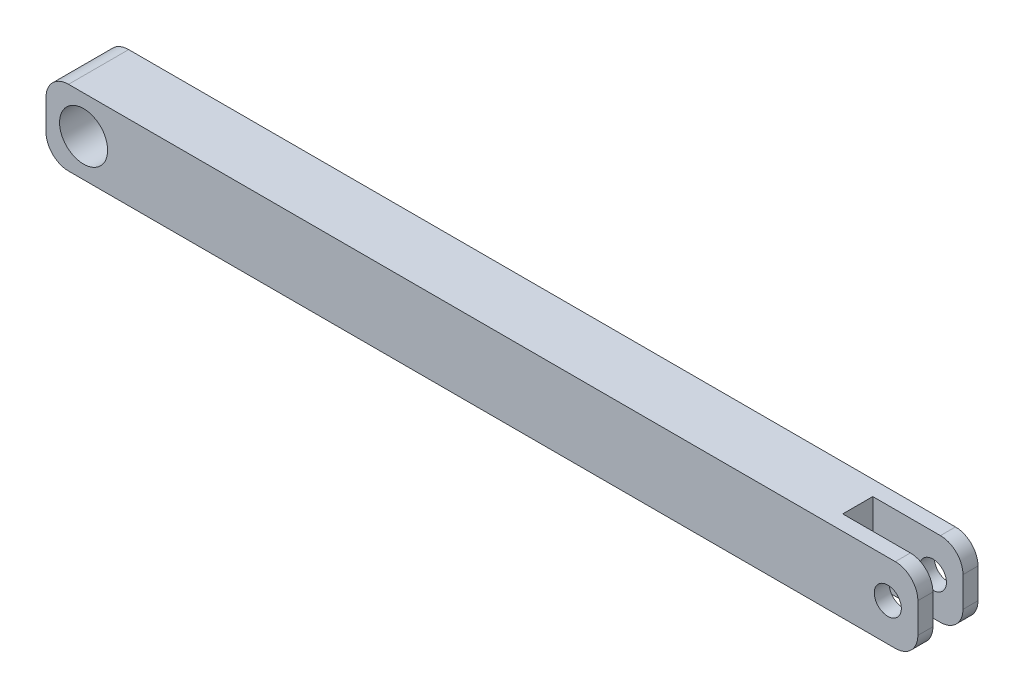
ISO-10303-21;
HEADER;
FILE_DESCRIPTION(('STEP AP214'),'2;1');
FILE_NAME('part.step','',(''),(''),'','','');
FILE_SCHEMA(('AUTOMOTIVE_DESIGN { 1 0 10303 214 1 1 1 1 }'));
ENDSEC;
DATA;
#1=APPLICATION_CONTEXT('core data for automotive mechanical design processes');
#2=APPLICATION_PROTOCOL_DEFINITION('international standard','automotive_design',2000,#1);
#3=PRODUCT_CONTEXT('',#1,'mechanical');
#4=PRODUCT('Part','Part','',(#3));
#5=PRODUCT_RELATED_PRODUCT_CATEGORY('part','',(#4));
#6=PRODUCT_DEFINITION_FORMATION('','',#4);
#7=PRODUCT_DEFINITION_CONTEXT('part definition',#1,'design');
#8=PRODUCT_DEFINITION('design','',#6,#7);
#9=PRODUCT_DEFINITION_SHAPE('','',#8);
#10=(LENGTH_UNIT() NAMED_UNIT(*) SI_UNIT(.MILLI.,.METRE.));
#11=(NAMED_UNIT(*) PLANE_ANGLE_UNIT() SI_UNIT($,.RADIAN.));
#12=(NAMED_UNIT(*) SI_UNIT($,.STERADIAN.) SOLID_ANGLE_UNIT());
#13=UNCERTAINTY_MEASURE_WITH_UNIT(LENGTH_MEASURE(1.E-05),#10,'distance_accuracy_value','');
#14=(GEOMETRIC_REPRESENTATION_CONTEXT(3) GLOBAL_UNCERTAINTY_ASSIGNED_CONTEXT((#13)) GLOBAL_UNIT_ASSIGNED_CONTEXT((#10,
#11,#12)) REPRESENTATION_CONTEXT('',''));
#15=CARTESIAN_POINT('',(0.,0.,0.));
#16=DIRECTION('',(0.,0.,1.));
#17=DIRECTION('',(1.,0.,0.));
#18=AXIS2_PLACEMENT_3D('',#15,#16,#17);
#19=CARTESIAN_POINT('',(58.,5.,3.));
#20=DIRECTION('',(-1.,0.,0.));
#21=DIRECTION('',(0.,0.,1.));
#22=AXIS2_PLACEMENT_3D('',#19,#20,#21);
#23=PLANE('',#22);
#24=DIRECTION('',(0.,0.,-1.));
#25=VECTOR('',#24,1.);
#26=CARTESIAN_POINT('',(58.,1.5,3.));
#27=LINE('',#26,#25);
#28=CARTESIAN_POINT('',(58.,1.5,3.5));
#29=VERTEX_POINT('',#28);
#30=CARTESIAN_POINT('',(58.,1.5,2.5));
#31=VERTEX_POINT('',#30);
#32=EDGE_CURVE('E257',#29,#31,#27,.T.);
#33=ORIENTED_EDGE('',*,*,#32,.T.);
#34=DIRECTION('',(0.,1.,0.));
#35=VECTOR('',#34,1.);
#36=CARTESIAN_POINT('',(58.,5.,2.5));
#37=LINE('',#36,#35);
#38=CARTESIAN_POINT('',(58.,3.5,2.5));
#39=VERTEX_POINT('',#38);
#40=EDGE_CURVE('E182',#31,#39,#37,.T.);
#41=ORIENTED_EDGE('',*,*,#40,.T.);
#42=DIRECTION('',(0.,0.,-1.));
#43=VECTOR('',#42,1.);
#44=CARTESIAN_POINT('',(58.,3.5,3.));
#45=LINE('',#44,#43);
#46=CARTESIAN_POINT('',(58.,3.5,3.5));
#47=VERTEX_POINT('',#46);
#48=EDGE_CURVE('E260',#39,#47,#45,.F.);
#49=ORIENTED_EDGE('',*,*,#48,.T.);
#50=DIRECTION('',(0.,1.,0.));
#51=VECTOR('',#50,1.);
#52=CARTESIAN_POINT('',(58.,1.5,3.5));
#53=LINE('',#52,#51);
#54=EDGE_CURVE('E229',#29,#47,#53,.T.);
#55=ORIENTED_EDGE('',*,*,#54,.F.);
#56=EDGE_LOOP('',(#33,#41,#49,#55));
#57=FACE_BOUND('',#56,.T.);
#58=ADVANCED_FACE('F41',(#57),#23,.F.);
#59=CARTESIAN_POINT('',(56.,2.5,3.001));
#60=DIRECTION('',(0.,0.,-1.));
#61=DIRECTION('',(-1.,0.,0.));
#62=AXIS2_PLACEMENT_3D('',#59,#60,#61);
#63=CYLINDRICAL_SURFACE('',#62,0.900000000000004);
#64=CARTESIAN_POINT('',(56.,2.5,2.5));
#65=DIRECTION('',(0.,0.,1.));
#66=DIRECTION('',(1.,0.,0.));
#67=AXIS2_PLACEMENT_3D('',#64,#65,#66);
#68=CIRCLE('',#67,0.900000000000004);
#69=CARTESIAN_POINT('',(55.1,2.5,2.5));
#70=VERTEX_POINT('',#69);
#71=EDGE_CURVE('E187',#70,#70,#68,.T.);
#72=CARTESIAN_POINT('',(56.,2.5,3.5));
#73=DIRECTION('',(0.,0.,1.));
#74=DIRECTION('',(1.,0.,0.));
#75=AXIS2_PLACEMENT_3D('',#72,#73,#74);
#76=CIRCLE('',#75,0.900000000000004);
#77=CARTESIAN_POINT('',(55.1,2.5,3.5));
#78=VERTEX_POINT('',#77);
#79=EDGE_CURVE('E220',#78,#78,#76,.T.);
#80=CARTESIAN_POINT('',(55.1,2.5,2.5));
#81=CARTESIAN_POINT('',(55.1,2.5,2.51041666666667));
#82=CARTESIAN_POINT('',(55.1,2.5,2.52083333333334));
#83=CARTESIAN_POINT('',(55.1,2.5,2.54166666666667));
#84=CARTESIAN_POINT('',(55.1,2.5,2.55208333333334));
#85=CARTESIAN_POINT('',(55.1,2.5,2.57291666666667));
#86=CARTESIAN_POINT('',(55.1,2.5,2.58333333333334));
#87=CARTESIAN_POINT('',(55.1,2.5,2.60416666666667));
#88=CARTESIAN_POINT('',(55.1,2.5,2.61458333333334));
#89=CARTESIAN_POINT('',(55.1,2.5,2.63541666666667));
#90=CARTESIAN_POINT('',(55.1,2.5,2.64583333333334));
#91=CARTESIAN_POINT('',(55.1,2.5,2.66666666666667));
#92=CARTESIAN_POINT('',(55.1,2.5,2.67708333333334));
#93=CARTESIAN_POINT('',(55.1,2.5,2.69791666666667));
#94=CARTESIAN_POINT('',(55.1,2.5,2.70833333333334));
#95=CARTESIAN_POINT('',(55.1,2.5,2.72916666666667));
#96=CARTESIAN_POINT('',(55.1,2.5,2.73958333333334));
#97=CARTESIAN_POINT('',(55.1,2.5,2.76041666666667));
#98=CARTESIAN_POINT('',(55.1,2.5,2.77083333333334));
#99=CARTESIAN_POINT('',(55.1,2.5,2.79166666666667));
#100=CARTESIAN_POINT('',(55.1,2.5,2.80208333333333));
#101=CARTESIAN_POINT('',(55.1,2.5,2.82291666666667));
#102=CARTESIAN_POINT('',(55.1,2.5,2.83333333333333));
#103=CARTESIAN_POINT('',(55.1,2.5,2.85416666666667));
#104=CARTESIAN_POINT('',(55.1,2.5,2.86458333333333));
#105=CARTESIAN_POINT('',(55.1,2.5,2.88541666666667));
#106=CARTESIAN_POINT('',(55.1,2.5,2.89583333333333));
#107=CARTESIAN_POINT('',(55.1,2.5,2.91666666666667));
#108=CARTESIAN_POINT('',(55.1,2.5,2.92708333333333));
#109=CARTESIAN_POINT('',(55.1,2.5,2.94791666666667));
#110=CARTESIAN_POINT('',(55.1,2.5,2.95833333333333));
#111=CARTESIAN_POINT('',(55.1,2.5,2.97916666666667));
#112=CARTESIAN_POINT('',(55.1,2.5,2.98958333333333));
#113=CARTESIAN_POINT('',(55.1,2.5,3.01041666666667));
#114=CARTESIAN_POINT('',(55.1,2.5,3.02083333333333));
#115=CARTESIAN_POINT('',(55.1,2.5,3.04166666666667));
#116=CARTESIAN_POINT('',(55.1,2.5,3.05208333333333));
#117=CARTESIAN_POINT('',(55.1,2.5,3.07291666666667));
#118=CARTESIAN_POINT('',(55.1,2.5,3.08333333333333));
#119=CARTESIAN_POINT('',(55.1,2.5,3.10416666666667));
#120=CARTESIAN_POINT('',(55.1,2.5,3.11458333333333));
#121=CARTESIAN_POINT('',(55.1,2.5,3.13541666666667));
#122=CARTESIAN_POINT('',(55.1,2.5,3.14583333333333));
#123=CARTESIAN_POINT('',(55.1,2.5,3.16666666666667));
#124=CARTESIAN_POINT('',(55.1,2.5,3.17708333333333));
#125=CARTESIAN_POINT('',(55.1,2.5,3.19791666666667));
#126=CARTESIAN_POINT('',(55.1,2.5,3.20833333333333));
#127=CARTESIAN_POINT('',(55.1,2.5,3.22916666666667));
#128=CARTESIAN_POINT('',(55.1,2.5,3.23958333333333));
#129=CARTESIAN_POINT('',(55.1,2.5,3.26041666666667));
#130=CARTESIAN_POINT('',(55.1,2.5,3.27083333333333));
#131=CARTESIAN_POINT('',(55.1,2.5,3.29166666666667));
#132=CARTESIAN_POINT('',(55.1,2.5,3.30208333333333));
#133=CARTESIAN_POINT('',(55.1,2.5,3.32291666666667));
#134=CARTESIAN_POINT('',(55.1,2.5,3.33333333333333));
#135=CARTESIAN_POINT('',(55.1,2.5,3.35416666666667));
#136=CARTESIAN_POINT('',(55.1,2.5,3.36458333333333));
#137=CARTESIAN_POINT('',(55.1,2.5,3.38541666666667));
#138=CARTESIAN_POINT('',(55.1,2.5,3.39583333333333));
#139=CARTESIAN_POINT('',(55.1,2.5,3.41666666666667));
#140=CARTESIAN_POINT('',(55.1,2.5,3.42708333333333));
#141=CARTESIAN_POINT('',(55.1,2.5,3.44791666666667));
#142=CARTESIAN_POINT('',(55.1,2.5,3.45833333333333));
#143=CARTESIAN_POINT('',(55.1,2.5,3.47916666666667));
#144=CARTESIAN_POINT('',(55.1,2.5,3.48958333333333));
#145=CARTESIAN_POINT('',(55.1,2.5,3.5));
#146=B_SPLINE_CURVE_WITH_KNOTS('',3,(#80,#81,#82,#83,#84,#85,#86,#87,#88,#89,#90,#91,#92,#93,
#94,#95,#96,#97,#98,#99,#100,#101,#102,#103,#104,#105,#106,#107,#108,#109,#110,#111,#112,#113,
#114,#115,#116,#117,#118,#119,#120,#121,#122,#123,#124,#125,#126,#127,#128,#129,#130,#131,#132,
#133,#134,#135,#136,#137,#138,#139,#140,#141,#142,#143,#144,#145),.UNSPECIFIED.,.F.,.F.,(4,2,2,
2,2,2,2,2,2,2,2,2,2,2,2,2,2,2,2,2,2,2,2,2,2,2,2,2,2,2,2,2,4),(0.,0.0312499999999996,
0.0624999999999996,0.0937499999999997,0.125,0.156249999999999,0.187499999999999,
0.218749999999999,0.249999999999999,0.281249999999999,0.312499999999999,0.343749999999999,
0.374999999999999,0.406249999999999,0.437499999999999,0.468749999999999,0.499999999999999,
0.531249999999998,0.562499999999998,0.593749999999998,0.624999999999998,0.656249999999998,
0.687499999999998,0.718749999999998,0.749999999999998,0.781249999999998,0.812499999999998,
0.843749999999998,0.874999999999998,0.906249999999998,0.937499999999997,0.968749999999997,
0.999999999999997),.UNSPECIFIED.);
#147=EDGE_CURVE('BSEAM290',#70,#78,#146,.T.);
#148=ORIENTED_EDGE('',*,*,#71,.F.);
#149=ORIENTED_EDGE('',*,*,#79,.T.);
#150=ORIENTED_EDGE('',*,*,#147,.T.);
#151=ORIENTED_EDGE('',*,*,#147,.F.);
#152=EDGE_LOOP('',(#148,#150,#149,#151));
#153=FACE_BOUND('',#152,.T.);
#154=ADVANCED_FACE('F290',(#153),#63,.F.);
#155=CARTESIAN_POINT('',(56.5,3.5,0.));
#156=DIRECTION('',(0.,0.,1.));
#157=DIRECTION('',(1.,0.,0.));
#158=AXIS2_PLACEMENT_3D('',#155,#156,#157);
#159=CYLINDRICAL_SURFACE('',#158,1.5);
#160=CARTESIAN_POINT('',(56.5,3.5,2.5));
#161=DIRECTION('',(0.,0.,1.));
#162=DIRECTION('',(1.,0.,0.));
#163=AXIS2_PLACEMENT_3D('',#160,#161,#162);
#164=CIRCLE('',#163,1.5);
#165=CARTESIAN_POINT('',(56.5,5.,2.5));
#166=VERTEX_POINT('',#165);
#167=EDGE_CURVE('E180',#166,#39,#164,.F.);
#168=ORIENTED_EDGE('',*,*,#167,.F.);
#169=DIRECTION('',(0.,0.,-1.));
#170=VECTOR('',#169,1.);
#171=CARTESIAN_POINT('',(56.5,5.,0.));
#172=LINE('',#171,#170);
#173=CARTESIAN_POINT('',(56.5,5.,3.5));
#174=VERTEX_POINT('',#173);
#175=EDGE_CURVE('E253',#174,#166,#172,.T.);
#176=ORIENTED_EDGE('',*,*,#175,.F.);
#177=CARTESIAN_POINT('',(56.5,3.5,3.5));
#178=DIRECTION('',(0.,0.,1.));
#179=DIRECTION('',(1.,0.,0.));
#180=AXIS2_PLACEMENT_3D('',#177,#178,#179);
#181=CIRCLE('',#180,1.5);
#182=EDGE_CURVE('E232',#47,#174,#181,.T.);
#183=ORIENTED_EDGE('',*,*,#182,.F.);
#184=ORIENTED_EDGE('',*,*,#48,.F.);
#185=EDGE_LOOP('',(#168,#176,#183,#184));
#186=FACE_BOUND('',#185,.T.);
#187=ADVANCED_FACE('F298',(#186),#159,.T.);
#188=CARTESIAN_POINT('',(56.5,1.5,3.));
#189=DIRECTION('',(0.,0.,-1.));
#190=DIRECTION('',(-1.,0.,0.));
#191=AXIS2_PLACEMENT_3D('',#188,#189,#190);
#192=CYLINDRICAL_SURFACE('',#191,1.5);
#193=CARTESIAN_POINT('',(56.5,1.5,2.5));
#194=DIRECTION('',(0.,0.,1.));
#195=DIRECTION('',(1.,0.,0.));
#196=AXIS2_PLACEMENT_3D('',#193,#194,#195);
#197=CIRCLE('',#196,1.5);
#198=CARTESIAN_POINT('',(56.5,0.,2.5));
#199=VERTEX_POINT('',#198);
#200=EDGE_CURVE('E185',#31,#199,#197,.F.);
#201=ORIENTED_EDGE('',*,*,#200,.F.);
#202=ORIENTED_EDGE('',*,*,#32,.F.);
#203=CARTESIAN_POINT('',(56.5,1.5,3.5));
#204=DIRECTION('',(0.,0.,1.));
#205=DIRECTION('',(1.,0.,0.));
#206=AXIS2_PLACEMENT_3D('',#203,#204,#205);
#207=CIRCLE('',#206,1.5);
#208=CARTESIAN_POINT('',(56.5,0.,3.5));
#209=VERTEX_POINT('',#208);
#210=EDGE_CURVE('E226',#209,#29,#207,.T.);
#211=ORIENTED_EDGE('',*,*,#210,.F.);
#212=DIRECTION('',(0.,0.,-1.));
#213=VECTOR('',#212,1.);
#214=CARTESIAN_POINT('',(56.5,0.,0.));
#215=LINE('',#214,#213);
#216=EDGE_CURVE('E56',#199,#209,#215,.F.);
#217=ORIENTED_EDGE('',*,*,#216,.F.);
#218=EDGE_LOOP('',(#201,#202,#211,#217));
#219=FACE_BOUND('',#218,.T.);
#220=ADVANCED_FACE('F288',(#219),#192,.T.);
#221=CARTESIAN_POINT('',(0.,5.,0.));
#222=DIRECTION('',(1.,0.,0.));
#223=DIRECTION('',(0.,0.,-1.));
#224=AXIS2_PLACEMENT_3D('',#221,#222,#223);
#225=PLANE('',#224);
#226=DIRECTION('',(0.,0.,1.));
#227=VECTOR('',#226,1.);
#228=CARTESIAN_POINT('',(0.,3.5,0.));
#229=LINE('',#228,#227);
#230=CARTESIAN_POINT('',(0.,3.5,3.5));
#231=VERTEX_POINT('',#230);
#232=CARTESIAN_POINT('',(0.,3.5,-0.5));
#233=VERTEX_POINT('',#232);
#234=EDGE_CURVE('E266',#231,#233,#229,.F.);
#235=ORIENTED_EDGE('',*,*,#234,.T.);
#236=DIRECTION('',(0.,1.,0.));
#237=VECTOR('',#236,1.);
#238=CARTESIAN_POINT('',(0.,1.5,-0.5));
#239=LINE('',#238,#237);
#240=CARTESIAN_POINT('',(0.,1.5,-0.5));
#241=VERTEX_POINT('',#240);
#242=EDGE_CURVE('E217',#241,#233,#239,.T.);
#243=ORIENTED_EDGE('',*,*,#242,.F.);
#244=DIRECTION('',(0.,0.,1.));
#245=VECTOR('',#244,1.);
#246=CARTESIAN_POINT('',(0.,1.5,0.));
#247=LINE('',#246,#245);
#248=CARTESIAN_POINT('',(0.,1.5,3.5));
#249=VERTEX_POINT('',#248);
#250=EDGE_CURVE('E151',#241,#249,#247,.T.);
#251=ORIENTED_EDGE('',*,*,#250,.T.);
#252=DIRECTION('',(0.,-1.,0.));
#253=VECTOR('',#252,1.);
#254=CARTESIAN_POINT('',(0.,3.5,3.5));
#255=LINE('',#254,#253);
#256=EDGE_CURVE('E241',#231,#249,#255,.T.);
#257=ORIENTED_EDGE('',*,*,#256,.F.);
#258=EDGE_LOOP('',(#235,#243,#251,#257));
#259=FACE_BOUND('',#258,.T.);
#260=ADVANCED_FACE('F271',(#259),#225,.F.);
#261=CARTESIAN_POINT('',(58.,3.5,-0.500000000000004));
#262=VERTEX_POINT('',#261);
#263=CARTESIAN_POINT('',(58.,3.5,0.5));
#264=VERTEX_POINT('',#263);
#265=EDGE_CURVE('E261',#262,#264,#45,.F.);
#266=ORIENTED_EDGE('',*,*,#265,.T.);
#267=DIRECTION('',(0.,-1.,0.));
#268=VECTOR('',#267,1.);
#269=CARTESIAN_POINT('',(58.,5.,0.5));
#270=LINE('',#269,#268);
#271=CARTESIAN_POINT('',(58.,1.5,0.499999999999999));
#272=VERTEX_POINT('',#271);
#273=EDGE_CURVE('E168',#264,#272,#270,.T.);
#274=ORIENTED_EDGE('',*,*,#273,.T.);
#275=CARTESIAN_POINT('',(58.,1.5,-0.500000000000004));
#276=VERTEX_POINT('',#275);
#277=EDGE_CURVE('E256',#272,#276,#27,.T.);
#278=ORIENTED_EDGE('',*,*,#277,.T.);
#279=DIRECTION('',(0.,-1.,0.));
#280=VECTOR('',#279,1.);
#281=CARTESIAN_POINT('',(58.,3.5,-0.500000000000004));
#282=LINE('',#281,#280);
#283=EDGE_CURVE('E205',#262,#276,#282,.T.);
#284=ORIENTED_EDGE('',*,*,#283,.F.);
#285=EDGE_LOOP('',(#266,#274,#278,#284));
#286=FACE_BOUND('',#285,.T.);
#287=ADVANCED_FACE('F293',(#286),#23,.F.);
#288=CARTESIAN_POINT('',(0.,5.,0.));
#289=DIRECTION('',(0.,1.,0.));
#290=DIRECTION('',(0.,0.,1.));
#291=AXIS2_PLACEMENT_3D('',#288,#289,#290);
#292=PLANE('',#291);
#293=DIRECTION('',(1.,0.,0.));
#294=VECTOR('',#293,1.);
#295=CARTESIAN_POINT('',(0.,5.,2.5));
#296=LINE('',#295,#294);
#297=CARTESIAN_POINT('',(52.,5.,2.5));
#298=VERTEX_POINT('',#297);
#299=EDGE_CURVE('E178',#298,#166,#296,.T.);
#300=ORIENTED_EDGE('',*,*,#299,.F.);
#301=DIRECTION('',(0.,0.,1.));
#302=VECTOR('',#301,1.);
#303=CARTESIAN_POINT('',(52.,5.,0.7));
#304=LINE('',#303,#302);
#305=CARTESIAN_POINT('',(52.,5.,0.499999999999999));
#306=VERTEX_POINT('',#305);
#307=EDGE_CURVE('E248',#306,#298,#304,.T.);
#308=ORIENTED_EDGE('',*,*,#307,.F.);
#309=DIRECTION('',(-1.,0.,0.));
#310=VECTOR('',#309,1.);
#311=CARTESIAN_POINT('',(0.,5.,0.499999999999992));
#312=LINE('',#311,#310);
#313=CARTESIAN_POINT('',(56.5,5.,0.499999999999999));
#314=VERTEX_POINT('',#313);
#315=EDGE_CURVE('E158',#314,#306,#312,.T.);
#316=ORIENTED_EDGE('',*,*,#315,.F.);
#317=CARTESIAN_POINT('',(56.5,5.,-0.500000000000004));
#318=VERTEX_POINT('',#317);
#319=EDGE_CURVE('E252',#314,#318,#172,.T.);
#320=ORIENTED_EDGE('',*,*,#319,.T.);
#321=DIRECTION('',(1.,0.,0.));
#322=VECTOR('',#321,1.);
#323=CARTESIAN_POINT('',(1.50000000000002,5.,-0.5));
#324=LINE('',#323,#322);
#325=CARTESIAN_POINT('',(1.50000000000002,5.,-0.5));
#326=VERTEX_POINT('',#325);
#327=EDGE_CURVE('E199',#326,#318,#324,.T.);
#328=ORIENTED_EDGE('',*,*,#327,.F.);
#329=DIRECTION('',(0.,0.,1.));
#330=VECTOR('',#329,1.);
#331=CARTESIAN_POINT('',(1.5,5.,3.));
#332=LINE('',#331,#330);
#333=CARTESIAN_POINT('',(1.5,5.,3.5));
#334=VERTEX_POINT('',#333);
#335=EDGE_CURVE('E250',#326,#334,#332,.T.);
#336=ORIENTED_EDGE('',*,*,#335,.T.);
#337=DIRECTION('',(-1.,0.,0.));
#338=VECTOR('',#337,1.);
#339=CARTESIAN_POINT('',(56.5,5.,3.5));
#340=LINE('',#339,#338);
#341=EDGE_CURVE('E235',#174,#334,#340,.T.);
#342=ORIENTED_EDGE('',*,*,#341,.F.);
#343=ORIENTED_EDGE('',*,*,#175,.T.);
#344=EDGE_LOOP('',(#300,#308,#316,#320,#328,#336,#342,#343));
#345=FACE_BOUND('',#344,.T.);
#346=ADVANCED_FACE('F305',(#345),#292,.T.);
#347=CARTESIAN_POINT('',(0.,0.,0.));
#348=DIRECTION('',(0.,1.,0.));
#349=DIRECTION('',(0.,0.,1.));
#350=AXIS2_PLACEMENT_3D('',#347,#348,#349);
#351=PLANE('',#350);
#352=DIRECTION('',(0.,0.,1.));
#353=VECTOR('',#352,1.);
#354=CARTESIAN_POINT('',(52.,0.,0.));
#355=LINE('',#354,#353);
#356=CARTESIAN_POINT('',(52.,0.,0.499999999999999));
#357=VERTEX_POINT('',#356);
#358=CARTESIAN_POINT('',(52.,0.,2.5));
#359=VERTEX_POINT('',#358);
#360=EDGE_CURVE('E49',#357,#359,#355,.T.);
#361=ORIENTED_EDGE('',*,*,#360,.T.);
#362=DIRECTION('',(-1.,0.,0.));
#363=VECTOR('',#362,1.);
#364=CARTESIAN_POINT('',(58.446661910034,0.,2.5));
#365=LINE('',#364,#363);
#366=EDGE_CURVE('E159',#199,#359,#365,.T.);
#367=ORIENTED_EDGE('',*,*,#366,.F.);
#368=ORIENTED_EDGE('',*,*,#216,.T.);
#369=DIRECTION('',(1.,0.,0.));
#370=VECTOR('',#369,1.);
#371=CARTESIAN_POINT('',(1.5,0.,3.5));
#372=LINE('',#371,#370);
#373=CARTESIAN_POINT('',(1.5,0.,3.5));
#374=VERTEX_POINT('',#373);
#375=EDGE_CURVE('E246',#374,#209,#372,.T.);
#376=ORIENTED_EDGE('',*,*,#375,.F.);
#377=DIRECTION('',(0.,0.,1.));
#378=VECTOR('',#377,1.);
#379=CARTESIAN_POINT('',(1.5,0.,0.));
#380=LINE('',#379,#378);
#381=CARTESIAN_POINT('',(1.50000000000002,0.,-0.5));
#382=VERTEX_POINT('',#381);
#383=EDGE_CURVE('E64',#374,#382,#380,.F.);
#384=ORIENTED_EDGE('',*,*,#383,.T.);
#385=DIRECTION('',(-1.,0.,0.));
#386=VECTOR('',#385,1.);
#387=CARTESIAN_POINT('',(56.5,0.,-0.500000000000004));
#388=LINE('',#387,#386);
#389=CARTESIAN_POINT('',(56.5,0.,-0.500000000000004));
#390=VERTEX_POINT('',#389);
#391=EDGE_CURVE('E211',#390,#382,#388,.T.);
#392=ORIENTED_EDGE('',*,*,#391,.F.);
#393=CARTESIAN_POINT('',(56.5,0.,0.499999999999999));
#394=VERTEX_POINT('',#393);
#395=EDGE_CURVE('E164',#390,#394,#215,.F.);
#396=ORIENTED_EDGE('',*,*,#395,.T.);
#397=DIRECTION('',(1.,0.,0.));
#398=VECTOR('',#397,1.);
#399=CARTESIAN_POINT('',(58.446661910034,0.,0.499999999999999));
#400=LINE('',#399,#398);
#401=EDGE_CURVE('E155',#357,#394,#400,.T.);
#402=ORIENTED_EDGE('',*,*,#401,.F.);
#403=EDGE_LOOP('',(#361,#367,#368,#376,#384,#392,#396,#402));
#404=FACE_BOUND('',#403,.T.);
#405=ADVANCED_FACE('F162',(#404),#351,.F.);
#406=CARTESIAN_POINT('',(2.5,2.5,-0.00100000000000057));
#407=DIRECTION('',(0.,0.,1.));
#408=DIRECTION('',(1.,0.,0.));
#409=AXIS2_PLACEMENT_3D('',#406,#407,#408);
#410=CYLINDRICAL_SURFACE('',#409,1.6);
#411=CARTESIAN_POINT('',(2.5,2.5,3.5));
#412=DIRECTION('',(0.,0.,1.));
#413=DIRECTION('',(1.,0.,0.));
#414=AXIS2_PLACEMENT_3D('',#411,#412,#413);
#415=CIRCLE('',#414,1.6);
#416=CARTESIAN_POINT('',(4.1,2.5,3.5));
#417=VERTEX_POINT('',#416);
#418=EDGE_CURVE('E223',#417,#417,#415,.T.);
#419=ORIENTED_EDGE('',*,*,#418,.T.);
#420=EDGE_LOOP('',(#419));
#421=FACE_BOUND('',#420,.T.);
#422=CARTESIAN_POINT('',(2.5,2.5,-0.5));
#423=DIRECTION('',(0.,0.,-1.));
#424=DIRECTION('',(-1.,0.,0.));
#425=AXIS2_PLACEMENT_3D('',#422,#423,#424);
#426=CIRCLE('',#425,1.6);
#427=CARTESIAN_POINT('',(0.900000000000002,2.5,-0.5));
#428=VERTEX_POINT('',#427);
#429=EDGE_CURVE('E190',#428,#428,#426,.T.);
#430=ORIENTED_EDGE('',*,*,#429,.T.);
#431=EDGE_LOOP('',(#430));
#432=FACE_BOUND('',#431,.T.);
#433=ADVANCED_FACE('F346',(#421,#432),#410,.F.);
#434=CARTESIAN_POINT('',(56.,2.5,0.499999999999999));
#435=DIRECTION('',(0.,0.,-1.));
#436=DIRECTION('',(-1.,0.,0.));
#437=AXIS2_PLACEMENT_3D('',#434,#435,#436);
#438=CIRCLE('',#437,0.900000000000004);
#439=CARTESIAN_POINT('',(55.1,2.5,0.499999999999999));
#440=VERTEX_POINT('',#439);
#441=EDGE_CURVE('E175',#440,#440,#438,.T.);
#442=CARTESIAN_POINT('',(56.,2.5,-0.500000000000004));
#443=DIRECTION('',(0.,0.,-1.));
#444=DIRECTION('',(-1.,0.,0.));
#445=AXIS2_PLACEMENT_3D('',#442,#443,#444);
#446=CIRCLE('',#445,0.900000000000004);
#447=CARTESIAN_POINT('',(55.1,2.5,-0.500000000000003));
#448=VERTEX_POINT('',#447);
#449=EDGE_CURVE('E193',#448,#448,#446,.T.);
#450=CARTESIAN_POINT('',(55.1,2.5,0.499999999999999));
#451=CARTESIAN_POINT('',(55.1,2.5,0.489583333333332));
#452=CARTESIAN_POINT('',(55.1,2.5,0.479166666666666));
#453=CARTESIAN_POINT('',(55.1,2.5,0.458333333333332));
#454=CARTESIAN_POINT('',(55.1,2.5,0.447916666666666));
#455=CARTESIAN_POINT('',(55.1,2.5,0.427083333333332));
#456=CARTESIAN_POINT('',(55.1,2.5,0.416666666666666));
#457=CARTESIAN_POINT('',(55.1,2.5,0.395833333333332));
#458=CARTESIAN_POINT('',(55.1,2.5,0.385416666666666));
#459=CARTESIAN_POINT('',(55.1,2.5,0.364583333333332));
#460=CARTESIAN_POINT('',(55.1,2.5,0.354166666666665));
#461=CARTESIAN_POINT('',(55.1,2.5,0.333333333333332));
#462=CARTESIAN_POINT('',(55.1,2.5,0.322916666666665));
#463=CARTESIAN_POINT('',(55.1,2.5,0.302083333333332));
#464=CARTESIAN_POINT('',(55.1,2.5,0.291666666666665));
#465=CARTESIAN_POINT('',(55.1,2.5,0.270833333333332));
#466=CARTESIAN_POINT('',(55.1,2.5,0.260416666666665));
#467=CARTESIAN_POINT('',(55.1,2.5,0.239583333333332));
#468=CARTESIAN_POINT('',(55.1,2.5,0.229166666666665));
#469=CARTESIAN_POINT('',(55.1,2.5,0.208333333333332));
#470=CARTESIAN_POINT('',(55.1,2.5,0.197916666666665));
#471=CARTESIAN_POINT('',(55.1,2.5,0.177083333333332));
#472=CARTESIAN_POINT('',(55.1,2.5,0.166666666666665));
#473=CARTESIAN_POINT('',(55.1,2.5,0.145833333333332));
#474=CARTESIAN_POINT('',(55.1,2.5,0.135416666666665));
#475=CARTESIAN_POINT('',(55.1,2.5,0.114583333333331));
#476=CARTESIAN_POINT('',(55.1,2.5,0.104166666666665));
#477=CARTESIAN_POINT('',(55.1,2.5,0.0833333333333312));
#478=CARTESIAN_POINT('',(55.1,2.5,0.0729166666666646));
#479=CARTESIAN_POINT('',(55.1,2.5,0.0520833333333312));
#480=CARTESIAN_POINT('',(55.1,2.5,0.0416666666666645));
#481=CARTESIAN_POINT('',(55.1,2.5,0.0208333333333312));
#482=CARTESIAN_POINT('',(55.1,2.5,0.0104166666666645));
#483=CARTESIAN_POINT('',(55.1,2.5,-0.0104166666666688));
#484=CARTESIAN_POINT('',(55.1,2.5,-0.0208333333333355));
#485=CARTESIAN_POINT('',(55.1,2.5,-0.0416666666666689));
#486=CARTESIAN_POINT('',(55.1,2.5,-0.0520833333333355));
#487=CARTESIAN_POINT('',(55.1,2.5,-0.0729166666666689));
#488=CARTESIAN_POINT('',(55.1,2.5,-0.0833333333333356));
#489=CARTESIAN_POINT('',(55.1,2.5,-0.104166666666669));
#490=CARTESIAN_POINT('',(55.1,2.5,-0.114583333333336));
#491=CARTESIAN_POINT('',(55.1,2.5,-0.135416666666669));
#492=CARTESIAN_POINT('',(55.1,2.5,-0.145833333333336));
#493=CARTESIAN_POINT('',(55.1,2.5,-0.166666666666669));
#494=CARTESIAN_POINT('',(55.1,2.5,-0.177083333333336));
#495=CARTESIAN_POINT('',(55.1,2.5,-0.197916666666669));
#496=CARTESIAN_POINT('',(55.1,2.5,-0.208333333333336));
#497=CARTESIAN_POINT('',(55.1,2.5,-0.229166666666669));
#498=CARTESIAN_POINT('',(55.1,2.5,-0.239583333333336));
#499=CARTESIAN_POINT('',(55.1,2.5,-0.260416666666669));
#500=CARTESIAN_POINT('',(55.1,2.5,-0.270833333333336));
#501=CARTESIAN_POINT('',(55.1,2.5,-0.29166666666667));
#502=CARTESIAN_POINT('',(55.1,2.5,-0.302083333333336));
#503=CARTESIAN_POINT('',(55.1,2.5,-0.32291666666667));
#504=CARTESIAN_POINT('',(55.1,2.5,-0.333333333333337));
#505=CARTESIAN_POINT('',(55.1,2.5,-0.35416666666667));
#506=CARTESIAN_POINT('',(55.1,2.5,-0.364583333333337));
#507=CARTESIAN_POINT('',(55.1,2.5,-0.38541666666667));
#508=CARTESIAN_POINT('',(55.1,2.5,-0.395833333333337));
#509=CARTESIAN_POINT('',(55.1,2.5,-0.41666666666667));
#510=CARTESIAN_POINT('',(55.1,2.5,-0.427083333333337));
#511=CARTESIAN_POINT('',(55.1,2.5,-0.44791666666667));
#512=CARTESIAN_POINT('',(55.1,2.5,-0.458333333333337));
#513=CARTESIAN_POINT('',(55.1,2.5,-0.47916666666667));
#514=CARTESIAN_POINT('',(55.1,2.5,-0.489583333333337));
#515=CARTESIAN_POINT('',(55.1,2.5,-0.500000000000003));
#516=B_SPLINE_CURVE_WITH_KNOTS('',3,(#450,#451,#452,#453,#454,#455,#456,#457,#458,#459,#460,
#461,#462,#463,#464,#465,#466,#467,#468,#469,#470,#471,#472,#473,#474,#475,#476,#477,#478,#479,
#480,#481,#482,#483,#484,#485,#486,#487,#488,#489,#490,#491,#492,#493,#494,#495,#496,#497,#498,
#499,#500,#501,#502,#503,#504,#505,#506,#507,#508,#509,#510,#511,#512,#513,#514,#515),
.UNSPECIFIED.,.F.,.F.,(4,2,2,2,2,2,2,2,2,2,2,2,2,2,2,2,2,2,2,2,2,2,2,2,2,2,2,2,2,2,2,2,4),(0.,
0.03125,0.0625000000000001,0.0937500000000001,0.125,0.156250000000001,0.187500000000001,
0.218750000000001,0.250000000000001,0.281250000000001,0.312500000000001,0.343750000000001,
0.375000000000001,0.406250000000001,0.437500000000001,0.468750000000001,0.500000000000001,
0.531250000000001,0.562500000000001,0.593750000000001,0.625000000000001,0.656250000000001,
0.687500000000002,0.718750000000002,0.750000000000002,0.781250000000002,0.812500000000002,
0.843750000000002,0.875000000000003,0.906250000000003,0.937500000000003,0.968750000000003,1.),.UNSPECIFIED.);
#517=EDGE_CURVE('BSEAM301',#440,#448,#516,.T.);
#518=ORIENTED_EDGE('',*,*,#441,.F.);
#519=ORIENTED_EDGE('',*,*,#449,.T.);
#520=ORIENTED_EDGE('',*,*,#517,.T.);
#521=ORIENTED_EDGE('',*,*,#517,.F.);
#522=EDGE_LOOP('',(#518,#520,#519,#521));
#523=FACE_BOUND('',#522,.T.);
#524=ADVANCED_FACE('F301',(#523),#63,.F.);
#525=CARTESIAN_POINT('',(56.5,3.5,0.499999999999999));
#526=DIRECTION('',(0.,0.,-1.));
#527=DIRECTION('',(-1.,0.,0.));
#528=AXIS2_PLACEMENT_3D('',#525,#526,#527);
#529=CIRCLE('',#528,1.5);
#530=EDGE_CURVE('E172',#264,#314,#529,.F.);
#531=ORIENTED_EDGE('',*,*,#530,.F.);
#532=ORIENTED_EDGE('',*,*,#265,.F.);
#533=CARTESIAN_POINT('',(56.5,3.5,-0.500000000000004));
#534=DIRECTION('',(0.,0.,-1.));
#535=DIRECTION('',(-1.,0.,0.));
#536=AXIS2_PLACEMENT_3D('',#533,#534,#535);
#537=CIRCLE('',#536,1.5);
#538=EDGE_CURVE('E202',#318,#262,#537,.T.);
#539=ORIENTED_EDGE('',*,*,#538,.F.);
#540=ORIENTED_EDGE('',*,*,#319,.F.);
#541=EDGE_LOOP('',(#531,#532,#539,#540));
#542=FACE_BOUND('',#541,.T.);
#543=ADVANCED_FACE('F285',(#542),#159,.T.);
#544=CARTESIAN_POINT('',(56.5,1.5,0.499999999999999));
#545=DIRECTION('',(0.,0.,-1.));
#546=DIRECTION('',(-1.,0.,0.));
#547=AXIS2_PLACEMENT_3D('',#544,#545,#546);
#548=CIRCLE('',#547,1.5);
#549=EDGE_CURVE('E11',#394,#272,#548,.F.);
#550=ORIENTED_EDGE('',*,*,#549,.F.);
#551=ORIENTED_EDGE('',*,*,#395,.F.);
#552=CARTESIAN_POINT('',(56.5,1.5,-0.500000000000004));
#553=DIRECTION('',(0.,0.,-1.));
#554=DIRECTION('',(-1.,0.,0.));
#555=AXIS2_PLACEMENT_3D('',#552,#553,#554);
#556=CIRCLE('',#555,1.5);
#557=EDGE_CURVE('E208',#276,#390,#556,.T.);
#558=ORIENTED_EDGE('',*,*,#557,.F.);
#559=ORIENTED_EDGE('',*,*,#277,.F.);
#560=EDGE_LOOP('',(#550,#551,#558,#559));
#561=FACE_BOUND('',#560,.T.);
#562=ADVANCED_FACE('F278',(#561),#192,.T.);
#563=CARTESIAN_POINT('',(1.5,1.5,0.));
#564=DIRECTION('',(0.,0.,1.));
#565=DIRECTION('',(1.,0.,0.));
#566=AXIS2_PLACEMENT_3D('',#563,#564,#565);
#567=CYLINDRICAL_SURFACE('',#566,1.5);
#568=ORIENTED_EDGE('',*,*,#250,.F.);
#569=CARTESIAN_POINT('',(1.5,1.5,-0.5));
#570=DIRECTION('',(0.,0.,-1.));
#571=DIRECTION('',(-1.,0.,0.));
#572=AXIS2_PLACEMENT_3D('',#569,#570,#571);
#573=CIRCLE('',#572,1.5);
#574=EDGE_CURVE('E214',#382,#241,#573,.T.);
#575=ORIENTED_EDGE('',*,*,#574,.F.);
#576=ORIENTED_EDGE('',*,*,#383,.F.);
#577=CARTESIAN_POINT('',(1.5,1.5,3.5));
#578=DIRECTION('',(0.,0.,1.));
#579=DIRECTION('',(1.,0.,0.));
#580=AXIS2_PLACEMENT_3D('',#577,#578,#579);
#581=CIRCLE('',#580,1.5);
#582=EDGE_CURVE('E244',#249,#374,#581,.T.);
#583=ORIENTED_EDGE('',*,*,#582,.F.);
#584=EDGE_LOOP('',(#568,#575,#576,#583));
#585=FACE_BOUND('',#584,.T.);
#586=ADVANCED_FACE('F276',(#585),#567,.T.);
#587=CARTESIAN_POINT('',(1.5,3.5,0.));
#588=DIRECTION('',(0.,0.,-1.));
#589=DIRECTION('',(-1.,0.,0.));
#590=AXIS2_PLACEMENT_3D('',#587,#588,#589);
#591=CYLINDRICAL_SURFACE('',#590,1.5);
#592=ORIENTED_EDGE('',*,*,#335,.F.);
#593=CARTESIAN_POINT('',(1.5,3.5,-0.5));
#594=DIRECTION('',(0.,0.,-1.));
#595=DIRECTION('',(-1.,0.,0.));
#596=AXIS2_PLACEMENT_3D('',#593,#594,#595);
#597=CIRCLE('',#596,1.5);
#598=EDGE_CURVE('E196',#233,#326,#597,.T.);
#599=ORIENTED_EDGE('',*,*,#598,.F.);
#600=ORIENTED_EDGE('',*,*,#234,.F.);
#601=CARTESIAN_POINT('',(1.5,3.5,3.5));
#602=DIRECTION('',(0.,0.,1.));
#603=DIRECTION('',(1.,0.,0.));
#604=AXIS2_PLACEMENT_3D('',#601,#602,#603);
#605=CIRCLE('',#604,1.5);
#606=EDGE_CURVE('E238',#334,#231,#605,.T.);
#607=ORIENTED_EDGE('',*,*,#606,.F.);
#608=EDGE_LOOP('',(#592,#599,#600,#607));
#609=FACE_BOUND('',#608,.T.);
#610=ADVANCED_FACE('F43',(#609),#591,.T.);
#611=CARTESIAN_POINT('',(52.,-5.,0.7));
#612=DIRECTION('',(-1.,0.,0.));
#613=DIRECTION('',(0.,0.,1.));
#614=AXIS2_PLACEMENT_3D('',#611,#612,#613);
#615=PLANE('',#614);
#616=ORIENTED_EDGE('',*,*,#360,.F.);
#617=DIRECTION('',(0.,-1.,0.));
#618=VECTOR('',#617,1.);
#619=CARTESIAN_POINT('',(52.,10.,0.499999999999999));
#620=LINE('',#619,#618);
#621=EDGE_CURVE('E146',#306,#357,#620,.T.);
#622=ORIENTED_EDGE('',*,*,#621,.F.);
#623=ORIENTED_EDGE('',*,*,#307,.T.);
#624=DIRECTION('',(0.,-1.,0.));
#625=VECTOR('',#624,1.);
#626=CARTESIAN_POINT('',(52.,10.,2.5));
#627=LINE('',#626,#625);
#628=EDGE_CURVE('E148',#298,#359,#627,.T.);
#629=ORIENTED_EDGE('',*,*,#628,.T.);
#630=EDGE_LOOP('',(#616,#622,#623,#629));
#631=FACE_BOUND('',#630,.T.);
#632=ADVANCED_FACE('F145',(#631),#615,.F.);
#633=CARTESIAN_POINT('',(56.5,1.5,3.5));
#634=DIRECTION('',(0.,0.,1.));
#635=DIRECTION('',(1.,0.,0.));
#636=AXIS2_PLACEMENT_3D('',#633,#634,#635);
#637=PLANE('',#636);
#638=ORIENTED_EDGE('',*,*,#418,.F.);
#639=EDGE_LOOP('',(#638));
#640=FACE_BOUND('',#639,.T.);
#641=ORIENTED_EDGE('',*,*,#210,.T.);
#642=ORIENTED_EDGE('',*,*,#54,.T.);
#643=ORIENTED_EDGE('',*,*,#182,.T.);
#644=ORIENTED_EDGE('',*,*,#341,.T.);
#645=ORIENTED_EDGE('',*,*,#606,.T.);
#646=ORIENTED_EDGE('',*,*,#256,.T.);
#647=ORIENTED_EDGE('',*,*,#582,.T.);
#648=ORIENTED_EDGE('',*,*,#375,.T.);
#649=EDGE_LOOP('',(#641,#642,#643,#644,#645,#646,#647,#648));
#650=FACE_BOUND('',#649,.T.);
#651=ORIENTED_EDGE('',*,*,#79,.F.);
#652=EDGE_LOOP('',(#651));
#653=FACE_BOUND('',#652,.T.);
#654=ADVANCED_FACE('F273',(#640,#650,#653),#637,.T.);
#655=CARTESIAN_POINT('',(1.5,3.5,-0.5));
#656=DIRECTION('',(0.,0.,-1.));
#657=DIRECTION('',(-1.,0.,0.));
#658=AXIS2_PLACEMENT_3D('',#655,#656,#657);
#659=PLANE('',#658);
#660=ORIENTED_EDGE('',*,*,#449,.F.);
#661=EDGE_LOOP('',(#660));
#662=FACE_BOUND('',#661,.T.);
#663=ORIENTED_EDGE('',*,*,#598,.T.);
#664=ORIENTED_EDGE('',*,*,#327,.T.);
#665=ORIENTED_EDGE('',*,*,#538,.T.);
#666=ORIENTED_EDGE('',*,*,#283,.T.);
#667=ORIENTED_EDGE('',*,*,#557,.T.);
#668=ORIENTED_EDGE('',*,*,#391,.T.);
#669=ORIENTED_EDGE('',*,*,#574,.T.);
#670=ORIENTED_EDGE('',*,*,#242,.T.);
#671=EDGE_LOOP('',(#663,#664,#665,#666,#667,#668,#669,#670));
#672=FACE_BOUND('',#671,.T.);
#673=ORIENTED_EDGE('',*,*,#429,.F.);
#674=EDGE_LOOP('',(#673));
#675=FACE_BOUND('',#674,.T.);
#676=ADVANCED_FACE('F321',(#662,#672,#675),#659,.T.);
#677=CARTESIAN_POINT('',(58.446661910034,10.,0.499999999999999));
#678=DIRECTION('',(0.,0.,-1.));
#679=DIRECTION('',(-1.,0.,0.));
#680=AXIS2_PLACEMENT_3D('',#677,#678,#679);
#681=PLANE('',#680);
#682=ORIENTED_EDGE('',*,*,#441,.T.);
#683=EDGE_LOOP('',(#682));
#684=FACE_BOUND('',#683,.T.);
#685=ORIENTED_EDGE('',*,*,#315,.T.);
#686=ORIENTED_EDGE('',*,*,#621,.T.);
#687=ORIENTED_EDGE('',*,*,#401,.T.);
#688=ORIENTED_EDGE('',*,*,#549,.T.);
#689=ORIENTED_EDGE('',*,*,#273,.F.);
#690=ORIENTED_EDGE('',*,*,#530,.T.);
#691=EDGE_LOOP('',(#685,#686,#687,#688,#689,#690));
#692=FACE_BOUND('',#691,.T.);
#693=ADVANCED_FACE('F154',(#684,#692),#681,.F.);
#694=CARTESIAN_POINT('',(58.446661910034,10.,2.5));
#695=DIRECTION('',(0.,0.,1.));
#696=DIRECTION('',(1.,0.,0.));
#697=AXIS2_PLACEMENT_3D('',#694,#695,#696);
#698=PLANE('',#697);
#699=ORIENTED_EDGE('',*,*,#71,.T.);
#700=EDGE_LOOP('',(#699));
#701=FACE_BOUND('',#700,.T.);
#702=ORIENTED_EDGE('',*,*,#200,.T.);
#703=ORIENTED_EDGE('',*,*,#366,.T.);
#704=ORIENTED_EDGE('',*,*,#628,.F.);
#705=ORIENTED_EDGE('',*,*,#299,.T.);
#706=ORIENTED_EDGE('',*,*,#167,.T.);
#707=ORIENTED_EDGE('',*,*,#40,.F.);
#708=EDGE_LOOP('',(#702,#703,#704,#705,#706,#707));
#709=FACE_BOUND('',#708,.T.);
#710=ADVANCED_FACE('F329',(#701,#709),#698,.F.);
#711=CLOSED_SHELL('',(#58,#154,#187,#220,#260,#287,#346,#405,#433,#524,#543,#562,#586,#610,#632,
#654,#676,#693,#710));
#712=MANIFOLD_SOLID_BREP('B2',#711);
#713=ADVANCED_BREP_SHAPE_REPRESENTATION('',(#18,#712),#14);
#714=SHAPE_DEFINITION_REPRESENTATION(#9,#713);
ENDSEC;
END-ISO-10303-21;
